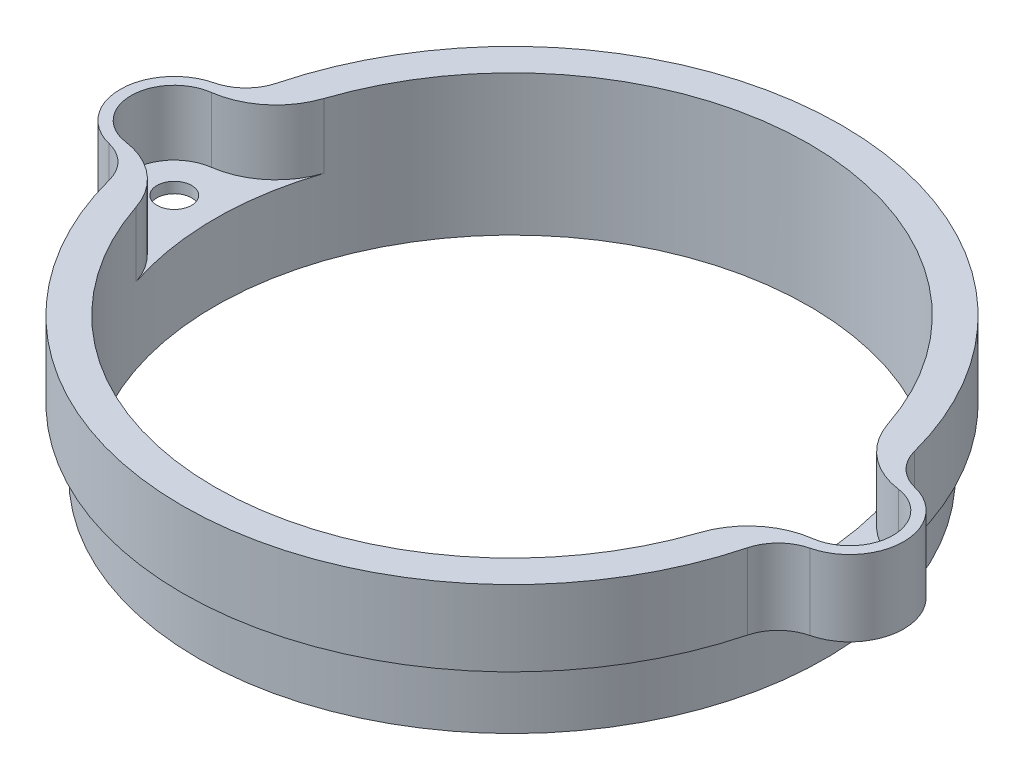
ISO-10303-21;
HEADER;
FILE_DESCRIPTION(('STEP AP214'),'2;1');
FILE_NAME('part.step','',(''),(''),'','','');
FILE_SCHEMA(('AUTOMOTIVE_DESIGN { 1 0 10303 214 1 1 1 1 }'));
ENDSEC;
DATA;
#1=APPLICATION_CONTEXT('core data for automotive mechanical design processes');
#2=APPLICATION_PROTOCOL_DEFINITION('international standard','automotive_design',2000,#1);
#3=PRODUCT_CONTEXT('',#1,'mechanical');
#4=PRODUCT('Part','Part','',(#3));
#5=PRODUCT_RELATED_PRODUCT_CATEGORY('part','',(#4));
#6=PRODUCT_DEFINITION_FORMATION('','',#4);
#7=PRODUCT_DEFINITION_CONTEXT('part definition',#1,'design');
#8=PRODUCT_DEFINITION('design','',#6,#7);
#9=PRODUCT_DEFINITION_SHAPE('','',#8);
#10=(LENGTH_UNIT() NAMED_UNIT(*) SI_UNIT(.MILLI.,.METRE.));
#11=(NAMED_UNIT(*) PLANE_ANGLE_UNIT() SI_UNIT($,.RADIAN.));
#12=(NAMED_UNIT(*) SI_UNIT($,.STERADIAN.) SOLID_ANGLE_UNIT());
#13=UNCERTAINTY_MEASURE_WITH_UNIT(LENGTH_MEASURE(1.E-05),#10,'distance_accuracy_value','');
#14=(GEOMETRIC_REPRESENTATION_CONTEXT(3) GLOBAL_UNCERTAINTY_ASSIGNED_CONTEXT((#13)) GLOBAL_UNIT_ASSIGNED_CONTEXT((#10,
#11,#12)) REPRESENTATION_CONTEXT('',''));
#15=CARTESIAN_POINT('',(0.,0.,0.));
#16=DIRECTION('',(0.,0.,1.));
#17=DIRECTION('',(1.,0.,0.));
#18=AXIS2_PLACEMENT_3D('',#15,#16,#17);
#19=CARTESIAN_POINT('',(31.25,7.,0.));
#20=DIRECTION('',(0.,1.,0.));
#21=DIRECTION('',(0.,0.,1.));
#22=AXIS2_PLACEMENT_3D('',#19,#20,#21);
#23=CYLINDRICAL_SURFACE('',#22,4.);
#24=CARTESIAN_POINT('',(31.25,7.,0.));
#25=DIRECTION('',(0.,1.,0.));
#26=DIRECTION('',(0.,0.,-1.));
#27=AXIS2_PLACEMENT_3D('',#24,#25,#26);
#28=CIRCLE('',#27,4.);
#29=CARTESIAN_POINT('',(31.7892727272727,7.,3.96348141481953));
#30=VERTEX_POINT('',#29);
#31=CARTESIAN_POINT('',(31.7892727272727,7.,-3.96348141481953));
#32=VERTEX_POINT('',#31);
#33=EDGE_CURVE('E168',#30,#32,#28,.T.);
#34=ORIENTED_EDGE('',*,*,#33,.F.);
#35=DIRECTION('',(0.,1.,0.));
#36=VECTOR('',#35,1.);
#37=CARTESIAN_POINT('',(31.7892727272727,-2.32567940145544,3.96348141481953));
#38=LINE('',#37,#36);
#39=CARTESIAN_POINT('',(31.7892727272727,13.,3.96348141481953));
#40=VERTEX_POINT('',#39);
#41=EDGE_CURVE('E154',#30,#40,#38,.T.);
#42=ORIENTED_EDGE('',*,*,#41,.T.);
#43=CARTESIAN_POINT('',(31.25,13.,0.));
#44=DIRECTION('',(0.,1.,0.));
#45=DIRECTION('',(0.,0.,-1.));
#46=AXIS2_PLACEMENT_3D('',#43,#44,#45);
#47=CIRCLE('',#46,4.);
#48=CARTESIAN_POINT('',(31.7892727272727,13.,-3.96348141481954));
#49=VERTEX_POINT('',#48);
#50=EDGE_CURVE('E167',#40,#49,#47,.T.);
#51=ORIENTED_EDGE('',*,*,#50,.T.);
#52=DIRECTION('',(0.,1.,0.));
#53=VECTOR('',#52,1.);
#54=CARTESIAN_POINT('',(31.7892727272727,-2.32567940145544,-3.96348141481954));
#55=LINE('',#54,#53);
#56=EDGE_CURVE('E354',#32,#49,#55,.T.);
#57=ORIENTED_EDGE('',*,*,#56,.F.);
#58=EDGE_LOOP('',(#34,#42,#51,#57));
#59=FACE_BOUND('',#58,.T.);
#60=ADVANCED_FACE('F37',(#59),#23,.F.);
#61=CARTESIAN_POINT('',(0.,13.,0.));
#62=DIRECTION('',(0.,1.,0.));
#63=DIRECTION('',(0.,0.,1.));
#64=AXIS2_PLACEMENT_3D('',#61,#62,#63);
#65=PLANE('',#64);
#66=CARTESIAN_POINT('',(32.733,13.,10.8995738907537));
#67=DIRECTION('',(0.,1.,0.));
#68=DIRECTION('',(0.,0.,-1.));
#69=AXIS2_PLACEMENT_3D('',#66,#67,#68);
#70=CIRCLE('',#69,7.);
#71=CARTESIAN_POINT('',(26.0915217391304,13.,8.68806614480372));
#72=VERTEX_POINT('',#71);
#73=EDGE_CURVE('E151',#72,#40,#70,.F.);
#74=ORIENTED_EDGE('',*,*,#73,.F.);
#75=CARTESIAN_POINT('',(0.,13.,0.));
#76=DIRECTION('',(0.,1.,0.));
#77=DIRECTION('',(0.,0.,1.));
#78=AXIS2_PLACEMENT_3D('',#75,#76,#77);
#79=CIRCLE('',#78,27.5);
#80=CARTESIAN_POINT('',(-26.0915217391304,13.,8.68806614480371));
#81=VERTEX_POINT('',#80);
#82=EDGE_CURVE('E253',#81,#72,#79,.T.);
#83=ORIENTED_EDGE('',*,*,#82,.F.);
#84=CARTESIAN_POINT('',(-32.733,13.,10.8995738907537));
#85=DIRECTION('',(0.,1.,0.));
#86=DIRECTION('',(0.,0.,1.));
#87=AXIS2_PLACEMENT_3D('',#84,#85,#86);
#88=CIRCLE('',#87,7.);
#89=CARTESIAN_POINT('',(-31.7892727272727,13.,3.96348141481954));
#90=VERTEX_POINT('',#89);
#91=EDGE_CURVE('E193',#81,#90,#88,.T.);
#92=ORIENTED_EDGE('',*,*,#91,.T.);
#93=CARTESIAN_POINT('',(-31.25,13.,0.));
#94=DIRECTION('',(0.,1.,0.));
#95=DIRECTION('',(0.,0.,1.));
#96=AXIS2_PLACEMENT_3D('',#93,#94,#95);
#97=CIRCLE('',#96,4.);
#98=CARTESIAN_POINT('',(-31.7892727272727,13.,-3.96348141481953));
#99=VERTEX_POINT('',#98);
#100=EDGE_CURVE('E232',#99,#90,#97,.T.);
#101=ORIENTED_EDGE('',*,*,#100,.F.);
#102=CARTESIAN_POINT('',(-32.733,13.,-10.8995738907537));
#103=DIRECTION('',(0.,1.,0.));
#104=DIRECTION('',(0.,0.,1.));
#105=AXIS2_PLACEMENT_3D('',#102,#103,#104);
#106=CIRCLE('',#105,7.);
#107=CARTESIAN_POINT('',(-26.0915217391304,13.,-8.68806614480372));
#108=VERTEX_POINT('',#107);
#109=EDGE_CURVE('E190',#108,#99,#106,.F.);
#110=ORIENTED_EDGE('',*,*,#109,.F.);
#111=CARTESIAN_POINT('',(26.0915217391304,13.,-8.68806614480371));
#112=VERTEX_POINT('',#111);
#113=EDGE_CURVE('E246',#112,#108,#79,.T.);
#114=ORIENTED_EDGE('',*,*,#113,.F.);
#115=CARTESIAN_POINT('',(32.733,13.,-10.8995738907537));
#116=DIRECTION('',(0.,1.,0.));
#117=DIRECTION('',(0.,0.,-1.));
#118=AXIS2_PLACEMENT_3D('',#115,#116,#117);
#119=CIRCLE('',#118,7.);
#120=EDGE_CURVE('E162',#112,#49,#119,.T.);
#121=ORIENTED_EDGE('',*,*,#120,.T.);
#122=ORIENTED_EDGE('',*,*,#50,.F.);
#123=EDGE_LOOP('',(#74,#83,#92,#101,#110,#114,#121,#122));
#124=FACE_BOUND('',#123,.T.);
#125=CARTESIAN_POINT('',(0.,13.,0.));
#126=DIRECTION('',(0.,1.,0.));
#127=DIRECTION('',(0.,0.,1.));
#128=AXIS2_PLACEMENT_3D('',#125,#126,#127);
#129=CIRCLE('',#128,30.5);
#130=CARTESIAN_POINT('',(-29.5036666666667,13.,7.73198895642138));
#131=VERTEX_POINT('',#130);
#132=CARTESIAN_POINT('',(29.5036666666667,13.,7.73198895642139));
#133=VERTEX_POINT('',#132);
#134=EDGE_CURVE('E256',#131,#133,#129,.T.);
#135=ORIENTED_EDGE('',*,*,#134,.T.);
#136=CARTESIAN_POINT('',(33.373,13.,8.74602029496845));
#137=DIRECTION('',(0.,1.,0.));
#138=DIRECTION('',(0.,0.,-1.));
#139=AXIS2_PLACEMENT_3D('',#136,#137,#138);
#140=CIRCLE('',#139,4.);
#141=CARTESIAN_POINT('',(32.4294444444444,13.,4.85890016387136));
#142=VERTEX_POINT('',#141);
#143=EDGE_CURVE('E374',#133,#142,#140,.F.);
#144=ORIENTED_EDGE('',*,*,#143,.T.);
#145=CARTESIAN_POINT('',(31.25,13.,0.));
#146=DIRECTION('',(0.,1.,0.));
#147=DIRECTION('',(0.,0.,-1.));
#148=AXIS2_PLACEMENT_3D('',#145,#146,#147);
#149=CIRCLE('',#148,5.);
#150=CARTESIAN_POINT('',(32.4294444444445,13.,-4.85890016387136));
#151=VERTEX_POINT('',#150);
#152=EDGE_CURVE('E177',#142,#151,#149,.T.);
#153=ORIENTED_EDGE('',*,*,#152,.T.);
#154=CARTESIAN_POINT('',(33.373,13.,-8.74602029496845));
#155=DIRECTION('',(0.,1.,0.));
#156=DIRECTION('',(0.,0.,-1.));
#157=AXIS2_PLACEMENT_3D('',#154,#155,#156);
#158=CIRCLE('',#157,4.);
#159=CARTESIAN_POINT('',(29.5036666666667,13.,-7.73198895642138));
#160=VERTEX_POINT('',#159);
#161=EDGE_CURVE('E60',#160,#151,#158,.T.);
#162=ORIENTED_EDGE('',*,*,#161,.F.);
#163=CARTESIAN_POINT('',(-29.5036666666667,13.,-7.73198895642139));
#164=VERTEX_POINT('',#163);
#165=EDGE_CURVE('E260',#160,#164,#129,.T.);
#166=ORIENTED_EDGE('',*,*,#165,.T.);
#167=CARTESIAN_POINT('',(-33.373,13.,-8.74602029496845));
#168=DIRECTION('',(0.,1.,0.));
#169=DIRECTION('',(0.,0.,1.));
#170=AXIS2_PLACEMENT_3D('',#167,#168,#169);
#171=CIRCLE('',#170,4.);
#172=CARTESIAN_POINT('',(-32.4294444444444,13.,-4.85890016387136));
#173=VERTEX_POINT('',#172);
#174=EDGE_CURVE('E225',#164,#173,#171,.F.);
#175=ORIENTED_EDGE('',*,*,#174,.T.);
#176=CARTESIAN_POINT('',(-31.25,13.,0.));
#177=DIRECTION('',(0.,1.,0.));
#178=DIRECTION('',(0.,0.,1.));
#179=AXIS2_PLACEMENT_3D('',#176,#177,#178);
#180=CIRCLE('',#179,5.);
#181=CARTESIAN_POINT('',(-32.4294444444445,13.,4.85890016387136));
#182=VERTEX_POINT('',#181);
#183=EDGE_CURVE('E235',#173,#182,#180,.T.);
#184=ORIENTED_EDGE('',*,*,#183,.T.);
#185=CARTESIAN_POINT('',(-33.373,13.,8.74602029496845));
#186=DIRECTION('',(0.,1.,0.));
#187=DIRECTION('',(0.,0.,1.));
#188=AXIS2_PLACEMENT_3D('',#185,#186,#187);
#189=CIRCLE('',#188,4.);
#190=EDGE_CURVE('E238',#131,#182,#189,.T.);
#191=ORIENTED_EDGE('',*,*,#190,.F.);
#192=EDGE_LOOP('',(#135,#144,#153,#162,#166,#175,#184,#191));
#193=FACE_BOUND('',#192,.T.);
#194=ADVANCED_FACE('F172',(#124,#193),#65,.T.);
#195=CARTESIAN_POINT('',(0.,13.,0.));
#196=DIRECTION('',(0.,-1.,0.));
#197=DIRECTION('',(0.,0.,-1.));
#198=AXIS2_PLACEMENT_3D('',#195,#196,#197);
#199=CYLINDRICAL_SURFACE('',#198,30.5);
#200=DIRECTION('',(0.,1.,0.));
#201=VECTOR('',#200,1.);
#202=CARTESIAN_POINT('',(29.5036666666667,7.,-7.73198895642137));
#203=LINE('',#202,#201);
#204=CARTESIAN_POINT('',(29.5036666666667,6.,-7.73198895642137));
#205=VERTEX_POINT('',#204);
#206=EDGE_CURVE('E181',#205,#160,#203,.T.);
#207=ORIENTED_EDGE('',*,*,#206,.F.);
#208=CARTESIAN_POINT('',(0.,6.,0.));
#209=DIRECTION('',(0.,1.,0.));
#210=DIRECTION('',(0.,0.,1.));
#211=AXIS2_PLACEMENT_3D('',#208,#209,#210);
#212=CIRCLE('',#211,30.5);
#213=CARTESIAN_POINT('',(-29.5036666666667,6.,-7.73198895642139));
#214=VERTEX_POINT('',#213);
#215=EDGE_CURVE('E255',#205,#214,#212,.T.);
#216=ORIENTED_EDGE('',*,*,#215,.T.);
#217=DIRECTION('',(0.,1.,0.));
#218=VECTOR('',#217,1.);
#219=CARTESIAN_POINT('',(-29.5036666666667,7.,-7.73198895642139));
#220=LINE('',#219,#218);
#221=EDGE_CURVE('E231',#214,#164,#220,.T.);
#222=ORIENTED_EDGE('',*,*,#221,.T.);
#223=ORIENTED_EDGE('',*,*,#165,.F.);
#224=EDGE_LOOP('',(#207,#216,#222,#223));
#225=FACE_BOUND('',#224,.T.);
#226=ADVANCED_FACE('F289',(#225),#199,.T.);
#227=CARTESIAN_POINT('',(-29.5036666666667,6.,7.73198895642137));
#228=VERTEX_POINT('',#227);
#229=CARTESIAN_POINT('',(29.5036666666667,6.,7.73198895642139));
#230=VERTEX_POINT('',#229);
#231=EDGE_CURVE('E261',#228,#230,#212,.T.);
#232=ORIENTED_EDGE('',*,*,#231,.T.);
#233=DIRECTION('',(0.,1.,0.));
#234=VECTOR('',#233,1.);
#235=CARTESIAN_POINT('',(29.5036666666667,7.,7.73198895642139));
#236=LINE('',#235,#234);
#237=EDGE_CURVE('E175',#230,#133,#236,.T.);
#238=ORIENTED_EDGE('',*,*,#237,.T.);
#239=ORIENTED_EDGE('',*,*,#134,.F.);
#240=DIRECTION('',(0.,1.,0.));
#241=VECTOR('',#240,1.);
#242=CARTESIAN_POINT('',(-29.5036666666667,7.,7.73198895642137));
#243=LINE('',#242,#241);
#244=EDGE_CURVE('E243',#228,#131,#243,.T.);
#245=ORIENTED_EDGE('',*,*,#244,.F.);
#246=EDGE_LOOP('',(#232,#238,#239,#245));
#247=FACE_BOUND('',#246,.T.);
#248=ADVANCED_FACE('F280',(#247),#199,.T.);
#249=CARTESIAN_POINT('',(-31.25,7.,0.));
#250=DIRECTION('',(0.,1.,0.));
#251=DIRECTION('',(0.,0.,1.));
#252=AXIS2_PLACEMENT_3D('',#249,#250,#251);
#253=CYLINDRICAL_SURFACE('',#252,4.);
#254=CARTESIAN_POINT('',(-31.25,7.,0.));
#255=DIRECTION('',(0.,1.,0.));
#256=DIRECTION('',(0.,0.,1.));
#257=AXIS2_PLACEMENT_3D('',#254,#255,#256);
#258=CIRCLE('',#257,4.);
#259=CARTESIAN_POINT('',(-31.7892727272727,7.,-3.96348141481953));
#260=VERTEX_POINT('',#259);
#261=CARTESIAN_POINT('',(-31.7892727272727,7.,3.96348141481953));
#262=VERTEX_POINT('',#261);
#263=EDGE_CURVE('E228',#260,#262,#258,.T.);
#264=ORIENTED_EDGE('',*,*,#263,.F.);
#265=DIRECTION('',(0.,1.,0.));
#266=VECTOR('',#265,1.);
#267=CARTESIAN_POINT('',(-31.7892727272727,-2.32567940145544,-3.96348141481953));
#268=LINE('',#267,#266);
#269=EDGE_CURVE('E195',#260,#99,#268,.T.);
#270=ORIENTED_EDGE('',*,*,#269,.T.);
#271=ORIENTED_EDGE('',*,*,#100,.T.);
#272=DIRECTION('',(0.,1.,0.));
#273=VECTOR('',#272,1.);
#274=CARTESIAN_POINT('',(-31.7892727272727,-2.32567940145544,3.96348141481954));
#275=LINE('',#274,#273);
#276=EDGE_CURVE('E209',#262,#90,#275,.T.);
#277=ORIENTED_EDGE('',*,*,#276,.F.);
#278=EDGE_LOOP('',(#264,#270,#271,#277));
#279=FACE_BOUND('',#278,.T.);
#280=ADVANCED_FACE('F273',(#279),#253,.F.);
#281=CARTESIAN_POINT('',(0.,0.,0.));
#282=DIRECTION('',(0.,1.,0.));
#283=DIRECTION('',(0.,0.,1.));
#284=AXIS2_PLACEMENT_3D('',#281,#282,#283);
#285=PLANE('',#284);
#286=CARTESIAN_POINT('',(0.,0.,0.));
#287=DIRECTION('',(0.,1.,0.));
#288=DIRECTION('',(0.,0.,1.));
#289=AXIS2_PLACEMENT_3D('',#286,#287,#288);
#290=CIRCLE('',#289,29.);
#291=CARTESIAN_POINT('',(0.,0.,29.));
#292=VERTEX_POINT('',#291);
#293=EDGE_CURVE('E41',#292,#292,#290,.T.);
#294=ORIENTED_EDGE('',*,*,#293,.F.);
#295=EDGE_LOOP('',(#294));
#296=FACE_BOUND('',#295,.T.);
#297=CARTESIAN_POINT('',(0.,0.,0.));
#298=DIRECTION('',(0.,1.,0.));
#299=DIRECTION('',(0.,0.,1.));
#300=AXIS2_PLACEMENT_3D('',#297,#298,#299);
#301=CIRCLE('',#300,27.5);
#302=CARTESIAN_POINT('',(0.,0.,27.5));
#303=VERTEX_POINT('',#302);
#304=EDGE_CURVE('E259',#303,#303,#301,.T.);
#305=ORIENTED_EDGE('',*,*,#304,.T.);
#306=EDGE_LOOP('',(#305));
#307=FACE_BOUND('',#306,.T.);
#308=ADVANCED_FACE('F271',(#296,#307),#285,.F.);
#309=CARTESIAN_POINT('',(0.,6.,0.));
#310=DIRECTION('',(0.,-1.,0.));
#311=DIRECTION('',(0.,0.,-1.));
#312=AXIS2_PLACEMENT_3D('',#309,#310,#311);
#313=CYLINDRICAL_SURFACE('',#312,29.);
#314=CARTESIAN_POINT('',(0.,6.,0.));
#315=DIRECTION('',(0.,1.,0.));
#316=DIRECTION('',(0.,0.,1.));
#317=AXIS2_PLACEMENT_3D('',#314,#315,#316);
#318=CIRCLE('',#317,29.);
#319=CARTESIAN_POINT('',(0.,6.,29.));
#320=VERTEX_POINT('',#319);
#321=EDGE_CURVE('E11',#320,#320,#318,.T.);
#322=ORIENTED_EDGE('',*,*,#321,.F.);
#323=EDGE_LOOP('',(#322));
#324=FACE_BOUND('',#323,.T.);
#325=ORIENTED_EDGE('',*,*,#293,.T.);
#326=EDGE_LOOP('',(#325));
#327=FACE_BOUND('',#326,.T.);
#328=ADVANCED_FACE('F39',(#324,#327),#313,.T.);
#329=CARTESIAN_POINT('',(0.,6.,0.));
#330=DIRECTION('',(0.,-1.,0.));
#331=DIRECTION('',(0.,0.,-1.));
#332=AXIS2_PLACEMENT_3D('',#329,#330,#331);
#333=CYLINDRICAL_SURFACE('',#332,27.5);
#334=ORIENTED_EDGE('',*,*,#304,.F.);
#335=EDGE_LOOP('',(#334));
#336=FACE_BOUND('',#335,.T.);
#337=CARTESIAN_POINT('',(0.,7.,0.));
#338=DIRECTION('',(0.,-1.,0.));
#339=DIRECTION('',(0.,0.,-1.));
#340=AXIS2_PLACEMENT_3D('',#337,#338,#339);
#341=CIRCLE('',#340,27.5);
#342=CARTESIAN_POINT('',(26.0915217391304,7.,-8.68806614480371));
#343=VERTEX_POINT('',#342);
#344=CARTESIAN_POINT('',(26.0915217391304,7.,8.68806614480371));
#345=VERTEX_POINT('',#344);
#346=EDGE_CURVE('E169',#343,#345,#341,.T.);
#347=ORIENTED_EDGE('',*,*,#346,.F.);
#348=DIRECTION('',(0.,1.,0.));
#349=VECTOR('',#348,1.);
#350=CARTESIAN_POINT('',(26.0915217391304,-2.32567940145544,-8.68806614480371));
#351=LINE('',#350,#349);
#352=EDGE_CURVE('E350',#343,#112,#351,.T.);
#353=ORIENTED_EDGE('',*,*,#352,.T.);
#354=ORIENTED_EDGE('',*,*,#113,.T.);
#355=DIRECTION('',(0.,1.,0.));
#356=VECTOR('',#355,1.);
#357=CARTESIAN_POINT('',(-26.0915217391304,-2.32567940145544,-8.68806614480372));
#358=LINE('',#357,#356);
#359=CARTESIAN_POINT('',(-26.0915217391304,7.,-8.68806614480371));
#360=VERTEX_POINT('',#359);
#361=EDGE_CURVE('E199',#360,#108,#358,.T.);
#362=ORIENTED_EDGE('',*,*,#361,.F.);
#363=CARTESIAN_POINT('',(0.,7.,0.));
#364=DIRECTION('',(0.,-1.,0.));
#365=DIRECTION('',(0.,0.,-1.));
#366=AXIS2_PLACEMENT_3D('',#363,#364,#365);
#367=CIRCLE('',#366,27.5);
#368=CARTESIAN_POINT('',(-26.0915217391304,7.,8.68806614480371));
#369=VERTEX_POINT('',#368);
#370=EDGE_CURVE('E196',#369,#360,#367,.T.);
#371=ORIENTED_EDGE('',*,*,#370,.F.);
#372=DIRECTION('',(0.,1.,0.));
#373=VECTOR('',#372,1.);
#374=CARTESIAN_POINT('',(-26.0915217391304,-2.32567940145544,8.68806614480371));
#375=LINE('',#374,#373);
#376=EDGE_CURVE('E207',#369,#81,#375,.T.);
#377=ORIENTED_EDGE('',*,*,#376,.T.);
#378=ORIENTED_EDGE('',*,*,#82,.T.);
#379=DIRECTION('',(0.,1.,0.));
#380=VECTOR('',#379,1.);
#381=CARTESIAN_POINT('',(26.0915217391304,-2.32567940145544,8.68806614480372));
#382=LINE('',#381,#380);
#383=EDGE_CURVE('E157',#345,#72,#382,.T.);
#384=ORIENTED_EDGE('',*,*,#383,.F.);
#385=EDGE_LOOP('',(#347,#353,#354,#362,#371,#377,#378,#384));
#386=FACE_BOUND('',#385,.T.);
#387=ADVANCED_FACE('F278',(#336,#386),#333,.F.);
#388=CARTESIAN_POINT('',(0.,6.,0.));
#389=DIRECTION('',(0.,1.,0.));
#390=DIRECTION('',(0.,0.,1.));
#391=AXIS2_PLACEMENT_3D('',#388,#389,#390);
#392=PLANE('',#391);
#393=ORIENTED_EDGE('',*,*,#215,.F.);
#394=CARTESIAN_POINT('',(33.373,6.,-8.74602029496845));
#395=DIRECTION('',(0.,-1.,0.));
#396=DIRECTION('',(0.,0.,1.));
#397=AXIS2_PLACEMENT_3D('',#394,#395,#396);
#398=CIRCLE('',#397,4.);
#399=CARTESIAN_POINT('',(32.4294444444445,6.,-4.85890016387136));
#400=VERTEX_POINT('',#399);
#401=EDGE_CURVE('E364',#205,#400,#398,.F.);
#402=ORIENTED_EDGE('',*,*,#401,.T.);
#403=CARTESIAN_POINT('',(31.25,6.,0.));
#404=DIRECTION('',(0.,-1.,0.));
#405=DIRECTION('',(0.,0.,1.));
#406=AXIS2_PLACEMENT_3D('',#403,#404,#405);
#407=CIRCLE('',#406,5.);
#408=CARTESIAN_POINT('',(32.4294444444444,6.,4.85890016387136));
#409=VERTEX_POINT('',#408);
#410=EDGE_CURVE('E368',#400,#409,#407,.T.);
#411=ORIENTED_EDGE('',*,*,#410,.T.);
#412=CARTESIAN_POINT('',(33.373,6.,8.74602029496845));
#413=DIRECTION('',(0.,-1.,0.));
#414=DIRECTION('',(0.,0.,1.));
#415=AXIS2_PLACEMENT_3D('',#412,#413,#414);
#416=CIRCLE('',#415,4.);
#417=EDGE_CURVE('E371',#409,#230,#416,.F.);
#418=ORIENTED_EDGE('',*,*,#417,.T.);
#419=ORIENTED_EDGE('',*,*,#231,.F.);
#420=CARTESIAN_POINT('',(-33.373,6.,8.74602029496845));
#421=DIRECTION('',(0.,-1.,0.));
#422=DIRECTION('',(0.,0.,-1.));
#423=AXIS2_PLACEMENT_3D('',#420,#421,#422);
#424=CIRCLE('',#423,4.);
#425=CARTESIAN_POINT('',(-32.4294444444445,6.,4.85890016387136));
#426=VERTEX_POINT('',#425);
#427=EDGE_CURVE('E216',#228,#426,#424,.F.);
#428=ORIENTED_EDGE('',*,*,#427,.T.);
#429=CARTESIAN_POINT('',(-31.25,6.,0.));
#430=DIRECTION('',(0.,-1.,0.));
#431=DIRECTION('',(0.,0.,-1.));
#432=AXIS2_PLACEMENT_3D('',#429,#430,#431);
#433=CIRCLE('',#432,5.);
#434=CARTESIAN_POINT('',(-32.4294444444444,6.,-4.85890016387136));
#435=VERTEX_POINT('',#434);
#436=EDGE_CURVE('E219',#426,#435,#433,.T.);
#437=ORIENTED_EDGE('',*,*,#436,.T.);
#438=CARTESIAN_POINT('',(-33.373,6.,-8.74602029496845));
#439=DIRECTION('',(0.,-1.,0.));
#440=DIRECTION('',(0.,0.,-1.));
#441=AXIS2_PLACEMENT_3D('',#438,#439,#440);
#442=CIRCLE('',#441,4.);
#443=EDGE_CURVE('E222',#435,#214,#442,.F.);
#444=ORIENTED_EDGE('',*,*,#443,.T.);
#445=EDGE_LOOP('',(#393,#402,#411,#418,#419,#428,#437,#444));
#446=FACE_BOUND('',#445,.T.);
#447=ORIENTED_EDGE('',*,*,#321,.T.);
#448=EDGE_LOOP('',(#447));
#449=FACE_BOUND('',#448,.T.);
#450=CARTESIAN_POINT('',(-31.25,6.,0.));
#451=DIRECTION('',(0.,-1.,0.));
#452=DIRECTION('',(0.,0.,-1.));
#453=AXIS2_PLACEMENT_3D('',#450,#451,#452);
#454=CIRCLE('',#453,1.6);
#455=CARTESIAN_POINT('',(-31.25,6.,-1.6));
#456=VERTEX_POINT('',#455);
#457=EDGE_CURVE('E213',#456,#456,#454,.T.);
#458=ORIENTED_EDGE('',*,*,#457,.F.);
#459=EDGE_LOOP('',(#458));
#460=FACE_BOUND('',#459,.T.);
#461=CARTESIAN_POINT('',(31.25,6.,0.));
#462=DIRECTION('',(0.,-1.,0.));
#463=DIRECTION('',(0.,0.,1.));
#464=AXIS2_PLACEMENT_3D('',#461,#462,#463);
#465=CIRCLE('',#464,1.6);
#466=CARTESIAN_POINT('',(31.25,6.,1.6));
#467=VERTEX_POINT('',#466);
#468=EDGE_CURVE('E361',#467,#467,#465,.T.);
#469=ORIENTED_EDGE('',*,*,#468,.F.);
#470=EDGE_LOOP('',(#469));
#471=FACE_BOUND('',#470,.T.);
#472=ADVANCED_FACE('F329',(#446,#449,#460,#471),#392,.F.);
#473=CARTESIAN_POINT('',(-33.373,7.,8.74602029496845));
#474=DIRECTION('',(0.,1.,0.));
#475=DIRECTION('',(0.,0.,1.));
#476=AXIS2_PLACEMENT_3D('',#473,#474,#475);
#477=CYLINDRICAL_SURFACE('',#476,4.);
#478=ORIENTED_EDGE('',*,*,#190,.T.);
#479=DIRECTION('',(0.,1.,0.));
#480=VECTOR('',#479,1.);
#481=CARTESIAN_POINT('',(-32.4294444444445,7.,4.85890016387136));
#482=LINE('',#481,#480);
#483=EDGE_CURVE('E247',#426,#182,#482,.T.);
#484=ORIENTED_EDGE('',*,*,#483,.F.);
#485=ORIENTED_EDGE('',*,*,#427,.F.);
#486=ORIENTED_EDGE('',*,*,#244,.T.);
#487=EDGE_LOOP('',(#478,#484,#485,#486));
#488=FACE_BOUND('',#487,.T.);
#489=ADVANCED_FACE('F325',(#488),#477,.F.);
#490=CARTESIAN_POINT('',(-31.25,7.,0.));
#491=DIRECTION('',(0.,1.,0.));
#492=DIRECTION('',(0.,0.,1.));
#493=AXIS2_PLACEMENT_3D('',#490,#491,#492);
#494=CYLINDRICAL_SURFACE('',#493,5.);
#495=ORIENTED_EDGE('',*,*,#183,.F.);
#496=DIRECTION('',(0.,1.,0.));
#497=VECTOR('',#496,1.);
#498=CARTESIAN_POINT('',(-32.4294444444444,7.,-4.85890016387136));
#499=LINE('',#498,#497);
#500=EDGE_CURVE('E249',#435,#173,#499,.T.);
#501=ORIENTED_EDGE('',*,*,#500,.F.);
#502=ORIENTED_EDGE('',*,*,#436,.F.);
#503=ORIENTED_EDGE('',*,*,#483,.T.);
#504=EDGE_LOOP('',(#495,#501,#502,#503));
#505=FACE_BOUND('',#504,.T.);
#506=ADVANCED_FACE('F328',(#505),#494,.T.);
#507=CARTESIAN_POINT('',(-33.373,7.,-8.74602029496845));
#508=DIRECTION('',(0.,1.,0.));
#509=DIRECTION('',(0.,0.,1.));
#510=AXIS2_PLACEMENT_3D('',#507,#508,#509);
#511=CYLINDRICAL_SURFACE('',#510,4.);
#512=ORIENTED_EDGE('',*,*,#174,.F.);
#513=ORIENTED_EDGE('',*,*,#221,.F.);
#514=ORIENTED_EDGE('',*,*,#443,.F.);
#515=ORIENTED_EDGE('',*,*,#500,.T.);
#516=EDGE_LOOP('',(#512,#513,#514,#515));
#517=FACE_BOUND('',#516,.T.);
#518=ADVANCED_FACE('F320',(#517),#511,.F.);
#519=CARTESIAN_POINT('',(0.,7.,0.));
#520=DIRECTION('',(0.,-1.,0.));
#521=DIRECTION('',(0.,0.,-1.));
#522=AXIS2_PLACEMENT_3D('',#519,#520,#521);
#523=PLANE('',#522);
#524=CARTESIAN_POINT('',(-31.25,7.,0.));
#525=DIRECTION('',(0.,-1.,0.));
#526=DIRECTION('',(0.,0.,-1.));
#527=AXIS2_PLACEMENT_3D('',#524,#525,#526);
#528=CIRCLE('',#527,1.6);
#529=CARTESIAN_POINT('',(-31.25,7.,-1.6));
#530=VERTEX_POINT('',#529);
#531=EDGE_CURVE('E204',#530,#530,#528,.T.);
#532=ORIENTED_EDGE('',*,*,#531,.T.);
#533=EDGE_LOOP('',(#532));
#534=FACE_BOUND('',#533,.T.);
#535=CARTESIAN_POINT('',(-32.733,7.,10.8995738907537));
#536=DIRECTION('',(0.,-1.,0.));
#537=DIRECTION('',(0.,0.,-1.));
#538=AXIS2_PLACEMENT_3D('',#535,#536,#537);
#539=CIRCLE('',#538,7.);
#540=EDGE_CURVE('E183',#369,#262,#539,.F.);
#541=ORIENTED_EDGE('',*,*,#540,.F.);
#542=ORIENTED_EDGE('',*,*,#370,.T.);
#543=CARTESIAN_POINT('',(-32.733,7.,-10.8995738907537));
#544=DIRECTION('',(0.,-1.,0.));
#545=DIRECTION('',(0.,0.,-1.));
#546=AXIS2_PLACEMENT_3D('',#543,#544,#545);
#547=CIRCLE('',#546,7.);
#548=EDGE_CURVE('E192',#360,#260,#547,.T.);
#549=ORIENTED_EDGE('',*,*,#548,.T.);
#550=ORIENTED_EDGE('',*,*,#263,.T.);
#551=EDGE_LOOP('',(#541,#542,#549,#550));
#552=FACE_BOUND('',#551,.T.);
#553=ADVANCED_FACE('F317',(#534,#552),#523,.F.);
#554=CARTESIAN_POINT('',(-31.25,6.,0.));
#555=DIRECTION('',(0.,1.,0.));
#556=DIRECTION('',(0.,0.,1.));
#557=AXIS2_PLACEMENT_3D('',#554,#555,#556);
#558=CYLINDRICAL_SURFACE('',#557,1.6);
#559=ORIENTED_EDGE('',*,*,#457,.T.);
#560=EDGE_LOOP('',(#559));
#561=FACE_BOUND('',#560,.T.);
#562=ORIENTED_EDGE('',*,*,#531,.F.);
#563=EDGE_LOOP('',(#562));
#564=FACE_BOUND('',#563,.T.);
#565=ADVANCED_FACE('F315',(#561,#564),#558,.F.);
#566=CARTESIAN_POINT('',(-32.733,-2.32567940145544,10.8995738907537));
#567=DIRECTION('',(0.,1.,0.));
#568=DIRECTION('',(0.,0.,1.));
#569=AXIS2_PLACEMENT_3D('',#566,#567,#568);
#570=CYLINDRICAL_SURFACE('',#569,7.);
#571=ORIENTED_EDGE('',*,*,#540,.T.);
#572=ORIENTED_EDGE('',*,*,#276,.T.);
#573=ORIENTED_EDGE('',*,*,#91,.F.);
#574=ORIENTED_EDGE('',*,*,#376,.F.);
#575=EDGE_LOOP('',(#571,#572,#573,#574));
#576=FACE_BOUND('',#575,.T.);
#577=ADVANCED_FACE('F311',(#576),#570,.T.);
#578=CARTESIAN_POINT('',(-32.733,-2.32567940145544,-10.8995738907537));
#579=DIRECTION('',(0.,1.,0.));
#580=DIRECTION('',(0.,0.,1.));
#581=AXIS2_PLACEMENT_3D('',#578,#579,#580);
#582=CYLINDRICAL_SURFACE('',#581,7.);
#583=ORIENTED_EDGE('',*,*,#361,.T.);
#584=ORIENTED_EDGE('',*,*,#109,.T.);
#585=ORIENTED_EDGE('',*,*,#269,.F.);
#586=ORIENTED_EDGE('',*,*,#548,.F.);
#587=EDGE_LOOP('',(#583,#584,#585,#586));
#588=FACE_BOUND('',#587,.T.);
#589=ADVANCED_FACE('F299',(#588),#582,.T.);
#590=CARTESIAN_POINT('',(33.373,7.,-8.74602029496845));
#591=DIRECTION('',(0.,1.,0.));
#592=DIRECTION('',(0.,0.,1.));
#593=AXIS2_PLACEMENT_3D('',#590,#591,#592);
#594=CYLINDRICAL_SURFACE('',#593,4.);
#595=ORIENTED_EDGE('',*,*,#161,.T.);
#596=DIRECTION('',(0.,1.,0.));
#597=VECTOR('',#596,1.);
#598=CARTESIAN_POINT('',(32.4294444444445,7.,-4.85890016387136));
#599=LINE('',#598,#597);
#600=EDGE_CURVE('E184',#400,#151,#599,.T.);
#601=ORIENTED_EDGE('',*,*,#600,.F.);
#602=ORIENTED_EDGE('',*,*,#401,.F.);
#603=ORIENTED_EDGE('',*,*,#206,.T.);
#604=EDGE_LOOP('',(#595,#601,#602,#603));
#605=FACE_BOUND('',#604,.T.);
#606=ADVANCED_FACE('F295',(#605),#594,.F.);
#607=CARTESIAN_POINT('',(31.25,7.,0.));
#608=DIRECTION('',(0.,1.,0.));
#609=DIRECTION('',(0.,0.,1.));
#610=AXIS2_PLACEMENT_3D('',#607,#608,#609);
#611=CYLINDRICAL_SURFACE('',#610,5.);
#612=ORIENTED_EDGE('',*,*,#152,.F.);
#613=DIRECTION('',(0.,1.,0.));
#614=VECTOR('',#613,1.);
#615=CARTESIAN_POINT('',(32.4294444444444,7.,4.85890016387136));
#616=LINE('',#615,#614);
#617=EDGE_CURVE('E186',#409,#142,#616,.T.);
#618=ORIENTED_EDGE('',*,*,#617,.F.);
#619=ORIENTED_EDGE('',*,*,#410,.F.);
#620=ORIENTED_EDGE('',*,*,#600,.T.);
#621=EDGE_LOOP('',(#612,#618,#619,#620));
#622=FACE_BOUND('',#621,.T.);
#623=ADVANCED_FACE('F298',(#622),#611,.T.);
#624=CARTESIAN_POINT('',(33.373,7.,8.74602029496845));
#625=DIRECTION('',(0.,1.,0.));
#626=DIRECTION('',(0.,0.,1.));
#627=AXIS2_PLACEMENT_3D('',#624,#625,#626);
#628=CYLINDRICAL_SURFACE('',#627,4.);
#629=ORIENTED_EDGE('',*,*,#143,.F.);
#630=ORIENTED_EDGE('',*,*,#237,.F.);
#631=ORIENTED_EDGE('',*,*,#417,.F.);
#632=ORIENTED_EDGE('',*,*,#617,.T.);
#633=EDGE_LOOP('',(#629,#630,#631,#632));
#634=FACE_BOUND('',#633,.T.);
#635=ADVANCED_FACE('F303',(#634),#628,.F.);
#636=CARTESIAN_POINT('',(0.,7.,0.));
#637=DIRECTION('',(0.,-1.,0.));
#638=DIRECTION('',(0.,0.,1.));
#639=AXIS2_PLACEMENT_3D('',#636,#637,#638);
#640=PLANE('',#639);
#641=CARTESIAN_POINT('',(31.25,7.,0.));
#642=DIRECTION('',(0.,-1.,0.));
#643=DIRECTION('',(0.,0.,1.));
#644=AXIS2_PLACEMENT_3D('',#641,#642,#643);
#645=CIRCLE('',#644,1.6);
#646=CARTESIAN_POINT('',(31.25,7.,1.6));
#647=VERTEX_POINT('',#646);
#648=EDGE_CURVE('E365',#647,#647,#645,.T.);
#649=ORIENTED_EDGE('',*,*,#648,.T.);
#650=EDGE_LOOP('',(#649));
#651=FACE_BOUND('',#650,.T.);
#652=CARTESIAN_POINT('',(32.733,7.,-10.8995738907537));
#653=DIRECTION('',(0.,-1.,0.));
#654=DIRECTION('',(0.,0.,-1.));
#655=AXIS2_PLACEMENT_3D('',#652,#653,#654);
#656=CIRCLE('',#655,7.);
#657=EDGE_CURVE('E352',#343,#32,#656,.F.);
#658=ORIENTED_EDGE('',*,*,#657,.F.);
#659=ORIENTED_EDGE('',*,*,#346,.T.);
#660=CARTESIAN_POINT('',(32.733,7.,10.8995738907537));
#661=DIRECTION('',(0.,-1.,0.));
#662=DIRECTION('',(0.,0.,-1.));
#663=AXIS2_PLACEMENT_3D('',#660,#661,#662);
#664=CIRCLE('',#663,7.);
#665=EDGE_CURVE('E52',#345,#30,#664,.T.);
#666=ORIENTED_EDGE('',*,*,#665,.T.);
#667=ORIENTED_EDGE('',*,*,#33,.T.);
#668=EDGE_LOOP('',(#658,#659,#666,#667));
#669=FACE_BOUND('',#668,.T.);
#670=ADVANCED_FACE('F307',(#651,#669),#640,.F.);
#671=CARTESIAN_POINT('',(31.25,6.,0.));
#672=DIRECTION('',(0.,1.,0.));
#673=DIRECTION('',(0.,0.,1.));
#674=AXIS2_PLACEMENT_3D('',#671,#672,#673);
#675=CYLINDRICAL_SURFACE('',#674,1.6);
#676=ORIENTED_EDGE('',*,*,#468,.T.);
#677=EDGE_LOOP('',(#676));
#678=FACE_BOUND('',#677,.T.);
#679=ORIENTED_EDGE('',*,*,#648,.F.);
#680=EDGE_LOOP('',(#679));
#681=FACE_BOUND('',#680,.T.);
#682=ADVANCED_FACE('F293',(#678,#681),#675,.F.);
#683=CARTESIAN_POINT('',(32.733,-2.32567940145544,-10.8995738907537));
#684=DIRECTION('',(0.,1.,0.));
#685=DIRECTION('',(0.,0.,1.));
#686=AXIS2_PLACEMENT_3D('',#683,#684,#685);
#687=CYLINDRICAL_SURFACE('',#686,7.);
#688=ORIENTED_EDGE('',*,*,#657,.T.);
#689=ORIENTED_EDGE('',*,*,#56,.T.);
#690=ORIENTED_EDGE('',*,*,#120,.F.);
#691=ORIENTED_EDGE('',*,*,#352,.F.);
#692=EDGE_LOOP('',(#688,#689,#690,#691));
#693=FACE_BOUND('',#692,.T.);
#694=ADVANCED_FACE('F356',(#693),#687,.T.);
#695=CARTESIAN_POINT('',(32.733,-2.32567940145544,10.8995738907537));
#696=DIRECTION('',(0.,1.,0.));
#697=DIRECTION('',(0.,0.,1.));
#698=AXIS2_PLACEMENT_3D('',#695,#696,#697);
#699=CYLINDRICAL_SURFACE('',#698,7.);
#700=ORIENTED_EDGE('',*,*,#383,.T.);
#701=ORIENTED_EDGE('',*,*,#73,.T.);
#702=ORIENTED_EDGE('',*,*,#41,.F.);
#703=ORIENTED_EDGE('',*,*,#665,.F.);
#704=EDGE_LOOP('',(#700,#701,#702,#703));
#705=FACE_BOUND('',#704,.T.);
#706=ADVANCED_FACE('F153',(#705),#699,.T.);
#707=CLOSED_SHELL('',(#60,#194,#226,#248,#280,#308,#328,#387,#472,#489,#506,#518,#553,#565,#577,
#589,#606,#623,#635,#670,#682,#694,#706));
#708=MANIFOLD_SOLID_BREP('B2',#707);
#709=ADVANCED_BREP_SHAPE_REPRESENTATION('',(#18,#708),#14);
#710=SHAPE_DEFINITION_REPRESENTATION(#9,#709);
ENDSEC;
END-ISO-10303-21;
